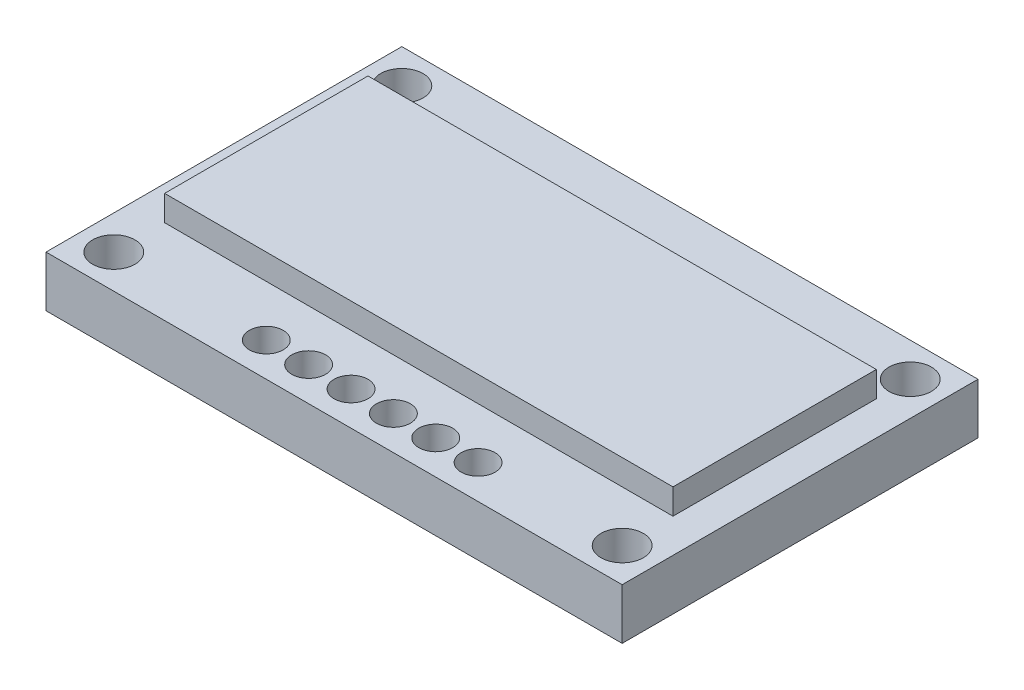
ISO-10303-21;
HEADER;
FILE_DESCRIPTION(('STEP AP214'),'2;1');
FILE_NAME('part.step','',(''),(''),'','','');
FILE_SCHEMA(('AUTOMOTIVE_DESIGN { 1 0 10303 214 1 1 1 1 }'));
ENDSEC;
DATA;
#1=APPLICATION_CONTEXT('core data for automotive mechanical design processes');
#2=APPLICATION_PROTOCOL_DEFINITION('international standard','automotive_design',2000,#1);
#3=PRODUCT_CONTEXT('',#1,'mechanical');
#4=PRODUCT('Part','Part','',(#3));
#5=PRODUCT_RELATED_PRODUCT_CATEGORY('part','',(#4));
#6=PRODUCT_DEFINITION_FORMATION('','',#4);
#7=PRODUCT_DEFINITION_CONTEXT('part definition',#1,'design');
#8=PRODUCT_DEFINITION('design','',#6,#7);
#9=PRODUCT_DEFINITION_SHAPE('','',#8);
#10=(LENGTH_UNIT() NAMED_UNIT(*) SI_UNIT(.MILLI.,.METRE.));
#11=(NAMED_UNIT(*) PLANE_ANGLE_UNIT() SI_UNIT($,.RADIAN.));
#12=(NAMED_UNIT(*) SI_UNIT($,.STERADIAN.) SOLID_ANGLE_UNIT());
#13=UNCERTAINTY_MEASURE_WITH_UNIT(LENGTH_MEASURE(1.E-05),#10,'distance_accuracy_value','');
#14=(GEOMETRIC_REPRESENTATION_CONTEXT(3) GLOBAL_UNCERTAINTY_ASSIGNED_CONTEXT((#13)) GLOBAL_UNIT_ASSIGNED_CONTEXT((#10,
#11,#12)) REPRESENTATION_CONTEXT('',''));
#15=CARTESIAN_POINT('',(0.,0.,0.));
#16=DIRECTION('',(0.,0.,1.));
#17=DIRECTION('',(1.,0.,0.));
#18=AXIS2_PLACEMENT_3D('',#15,#16,#17);
#19=CARTESIAN_POINT('',(0.,3.,0.));
#20=DIRECTION('',(0.,-1.,0.));
#21=DIRECTION('',(0.,0.,-1.));
#22=AXIS2_PLACEMENT_3D('',#19,#20,#21);
#23=PLANE('',#22);
#24=CARTESIAN_POINT('',(32.,3.,-2.));
#25=DIRECTION('',(0.,1.,0.));
#26=DIRECTION('',(0.,0.,1.));
#27=AXIS2_PLACEMENT_3D('',#24,#25,#26);
#28=CIRCLE('',#27,1.25);
#29=CARTESIAN_POINT('',(32.,3.,-0.750000000000002));
#30=VERTEX_POINT('',#29);
#31=EDGE_CURVE('E195',#30,#30,#28,.T.);
#32=ORIENTED_EDGE('',*,*,#31,.F.);
#33=EDGE_LOOP('',(#32));
#34=FACE_BOUND('',#33,.T.);
#35=CARTESIAN_POINT('',(32.,3.,-19.));
#36=DIRECTION('',(0.,1.,0.));
#37=DIRECTION('',(0.,0.,1.));
#38=AXIS2_PLACEMENT_3D('',#35,#36,#37);
#39=CIRCLE('',#38,1.25);
#40=CARTESIAN_POINT('',(32.,3.,-17.75));
#41=VERTEX_POINT('',#40);
#42=EDGE_CURVE('E185',#41,#41,#39,.T.);
#43=ORIENTED_EDGE('',*,*,#42,.F.);
#44=EDGE_LOOP('',(#43));
#45=FACE_BOUND('',#44,.T.);
#46=CARTESIAN_POINT('',(2.,3.,-19.));
#47=DIRECTION('',(0.,1.,0.));
#48=DIRECTION('',(0.,0.,1.));
#49=AXIS2_PLACEMENT_3D('',#46,#47,#48);
#50=CIRCLE('',#49,1.25);
#51=CARTESIAN_POINT('',(2.,3.,-17.75));
#52=VERTEX_POINT('',#51);
#53=EDGE_CURVE('E182',#52,#52,#50,.T.);
#54=ORIENTED_EDGE('',*,*,#53,.F.);
#55=EDGE_LOOP('',(#54));
#56=FACE_BOUND('',#55,.T.);
#57=CARTESIAN_POINT('',(2.,3.,-2.));
#58=DIRECTION('',(0.,1.,0.));
#59=DIRECTION('',(0.,0.,1.));
#60=AXIS2_PLACEMENT_3D('',#57,#58,#59);
#61=CIRCLE('',#60,1.25);
#62=CARTESIAN_POINT('',(2.,3.,-0.75));
#63=VERTEX_POINT('',#62);
#64=EDGE_CURVE('E179',#63,#63,#61,.T.);
#65=ORIENTED_EDGE('',*,*,#64,.F.);
#66=EDGE_LOOP('',(#65));
#67=FACE_BOUND('',#66,.T.);
#68=CARTESIAN_POINT('',(23.5,3.,-2.));
#69=DIRECTION('',(0.,1.,0.));
#70=DIRECTION('',(0.,0.,1.));
#71=AXIS2_PLACEMENT_3D('',#68,#69,#70);
#72=CIRCLE('',#71,1.);
#73=CARTESIAN_POINT('',(23.5,3.,-0.999999999999999));
#74=VERTEX_POINT('',#73);
#75=EDGE_CURVE('E175',#74,#74,#72,.T.);
#76=ORIENTED_EDGE('',*,*,#75,.F.);
#77=EDGE_LOOP('',(#76));
#78=FACE_BOUND('',#77,.T.);
#79=CARTESIAN_POINT('',(21.,3.,-2.));
#80=DIRECTION('',(0.,1.,0.));
#81=DIRECTION('',(0.,0.,1.));
#82=AXIS2_PLACEMENT_3D('',#79,#80,#81);
#83=CIRCLE('',#82,1.);
#84=CARTESIAN_POINT('',(21.,3.,-0.999999999999999));
#85=VERTEX_POINT('',#84);
#86=EDGE_CURVE('E171',#85,#85,#83,.T.);
#87=ORIENTED_EDGE('',*,*,#86,.F.);
#88=EDGE_LOOP('',(#87));
#89=FACE_BOUND('',#88,.T.);
#90=CARTESIAN_POINT('',(18.5,3.,-2.));
#91=DIRECTION('',(0.,1.,0.));
#92=DIRECTION('',(0.,0.,1.));
#93=AXIS2_PLACEMENT_3D('',#90,#91,#92);
#94=CIRCLE('',#93,1.);
#95=CARTESIAN_POINT('',(18.5,3.,-0.999999999999999));
#96=VERTEX_POINT('',#95);
#97=EDGE_CURVE('E167',#96,#96,#94,.T.);
#98=ORIENTED_EDGE('',*,*,#97,.F.);
#99=EDGE_LOOP('',(#98));
#100=FACE_BOUND('',#99,.T.);
#101=CARTESIAN_POINT('',(16.,3.,-2.));
#102=DIRECTION('',(0.,1.,0.));
#103=DIRECTION('',(0.,0.,1.));
#104=AXIS2_PLACEMENT_3D('',#101,#102,#103);
#105=CIRCLE('',#104,1.);
#106=CARTESIAN_POINT('',(16.,3.,-0.999999999999999));
#107=VERTEX_POINT('',#106);
#108=EDGE_CURVE('E163',#107,#107,#105,.T.);
#109=ORIENTED_EDGE('',*,*,#108,.F.);
#110=EDGE_LOOP('',(#109));
#111=FACE_BOUND('',#110,.T.);
#112=CARTESIAN_POINT('',(13.5,3.,-2.));
#113=DIRECTION('',(0.,1.,0.));
#114=DIRECTION('',(0.,0.,1.));
#115=AXIS2_PLACEMENT_3D('',#112,#113,#114);
#116=CIRCLE('',#115,1.);
#117=CARTESIAN_POINT('',(13.5,3.,-0.999999999999999));
#118=VERTEX_POINT('',#117);
#119=EDGE_CURVE('E159',#118,#118,#116,.T.);
#120=ORIENTED_EDGE('',*,*,#119,.F.);
#121=EDGE_LOOP('',(#120));
#122=FACE_BOUND('',#121,.T.);
#123=CARTESIAN_POINT('',(11.,3.,-2.));
#124=DIRECTION('',(0.,1.,0.));
#125=DIRECTION('',(0.,0.,1.));
#126=AXIS2_PLACEMENT_3D('',#123,#124,#125);
#127=CIRCLE('',#126,1.);
#128=CARTESIAN_POINT('',(11.,3.,-0.999999999999999));
#129=VERTEX_POINT('',#128);
#130=EDGE_CURVE('E155',#129,#129,#127,.T.);
#131=ORIENTED_EDGE('',*,*,#130,.F.);
#132=EDGE_LOOP('',(#131));
#133=FACE_BOUND('',#132,.T.);
#134=DIRECTION('',(0.,0.,1.));
#135=VECTOR('',#134,1.);
#136=CARTESIAN_POINT('',(0.,3.,0.));
#137=LINE('',#136,#135);
#138=CARTESIAN_POINT('',(0.,3.,-21.));
#139=VERTEX_POINT('',#138);
#140=CARTESIAN_POINT('',(0.,3.,0.));
#141=VERTEX_POINT('',#140);
#142=EDGE_CURVE('E130',#139,#141,#137,.T.);
#143=ORIENTED_EDGE('',*,*,#142,.T.);
#144=DIRECTION('',(1.,0.,0.));
#145=VECTOR('',#144,1.);
#146=CARTESIAN_POINT('',(0.,3.,0.));
#147=LINE('',#146,#145);
#148=CARTESIAN_POINT('',(34.,3.,0.));
#149=VERTEX_POINT('',#148);
#150=EDGE_CURVE('E133',#141,#149,#147,.T.);
#151=ORIENTED_EDGE('',*,*,#150,.T.);
#152=DIRECTION('',(0.,0.,-1.));
#153=VECTOR('',#152,1.);
#154=CARTESIAN_POINT('',(34.,3.,0.));
#155=LINE('',#154,#153);
#156=CARTESIAN_POINT('',(34.,3.,-21.));
#157=VERTEX_POINT('',#156);
#158=EDGE_CURVE('E136',#149,#157,#155,.T.);
#159=ORIENTED_EDGE('',*,*,#158,.T.);
#160=DIRECTION('',(-1.,0.,0.));
#161=VECTOR('',#160,1.);
#162=CARTESIAN_POINT('',(0.,3.,-21.));
#163=LINE('',#162,#161);
#164=EDGE_CURVE('E138',#157,#139,#163,.T.);
#165=ORIENTED_EDGE('',*,*,#164,.T.);
#166=EDGE_LOOP('',(#143,#151,#159,#165));
#167=FACE_BOUND('',#166,.T.);
#168=DIRECTION('',(0.,0.,1.));
#169=VECTOR('',#168,1.);
#170=CARTESIAN_POINT('',(2.,3.,-17.));
#171=LINE('',#170,#169);
#172=CARTESIAN_POINT('',(2.,3.,-17.));
#173=VERTEX_POINT('',#172);
#174=CARTESIAN_POINT('',(2.,3.,-5.));
#175=VERTEX_POINT('',#174);
#176=EDGE_CURVE('E120',#173,#175,#171,.T.);
#177=ORIENTED_EDGE('',*,*,#176,.F.);
#178=DIRECTION('',(-1.,0.,0.));
#179=VECTOR('',#178,1.);
#180=CARTESIAN_POINT('',(2.,3.,-17.));
#181=LINE('',#180,#179);
#182=CARTESIAN_POINT('',(32.,3.,-17.));
#183=VERTEX_POINT('',#182);
#184=EDGE_CURVE('E117',#183,#173,#181,.T.);
#185=ORIENTED_EDGE('',*,*,#184,.F.);
#186=DIRECTION('',(0.,0.,-1.));
#187=VECTOR('',#186,1.);
#188=CARTESIAN_POINT('',(32.,3.,-17.));
#189=LINE('',#188,#187);
#190=CARTESIAN_POINT('',(32.,3.,-5.));
#191=VERTEX_POINT('',#190);
#192=EDGE_CURVE('E55',#191,#183,#189,.T.);
#193=ORIENTED_EDGE('',*,*,#192,.F.);
#194=DIRECTION('',(1.,0.,0.));
#195=VECTOR('',#194,1.);
#196=CARTESIAN_POINT('',(2.,3.,-5.));
#197=LINE('',#196,#195);
#198=EDGE_CURVE('E50',#175,#191,#197,.T.);
#199=ORIENTED_EDGE('',*,*,#198,.F.);
#200=EDGE_LOOP('',(#177,#185,#193,#199));
#201=FACE_BOUND('',#200,.T.);
#202=ADVANCED_FACE('F33',(#34,#45,#56,#67,#78,#89,#100,#111,#122,#133,#167,#201),#23,.F.);
#203=CARTESIAN_POINT('',(0.,3.,0.));
#204=DIRECTION('',(1.,0.,0.));
#205=DIRECTION('',(0.,0.,-1.));
#206=AXIS2_PLACEMENT_3D('',#203,#204,#205);
#207=PLANE('',#206);
#208=DIRECTION('',(0.,0.,1.));
#209=VECTOR('',#208,1.);
#210=CARTESIAN_POINT('',(0.,0.,0.));
#211=LINE('',#210,#209);
#212=CARTESIAN_POINT('',(0.,0.,-21.));
#213=VERTEX_POINT('',#212);
#214=CARTESIAN_POINT('',(0.,0.,0.));
#215=VERTEX_POINT('',#214);
#216=EDGE_CURVE('E121',#213,#215,#211,.T.);
#217=ORIENTED_EDGE('',*,*,#216,.T.);
#218=DIRECTION('',(0.,-1.,0.));
#219=VECTOR('',#218,1.);
#220=CARTESIAN_POINT('',(0.,3.,0.));
#221=LINE('',#220,#219);
#222=EDGE_CURVE('E11',#141,#215,#221,.T.);
#223=ORIENTED_EDGE('',*,*,#222,.F.);
#224=ORIENTED_EDGE('',*,*,#142,.F.);
#225=DIRECTION('',(0.,-1.,0.));
#226=VECTOR('',#225,1.);
#227=CARTESIAN_POINT('',(0.,3.,-21.));
#228=LINE('',#227,#226);
#229=EDGE_CURVE('E139',#139,#213,#228,.T.);
#230=ORIENTED_EDGE('',*,*,#229,.T.);
#231=EDGE_LOOP('',(#217,#223,#224,#230));
#232=FACE_BOUND('',#231,.T.);
#233=ADVANCED_FACE('F35',(#232),#207,.F.);
#234=CARTESIAN_POINT('',(0.,3.,0.));
#235=DIRECTION('',(0.,0.,-1.));
#236=DIRECTION('',(-1.,0.,0.));
#237=AXIS2_PLACEMENT_3D('',#234,#235,#236);
#238=PLANE('',#237);
#239=DIRECTION('',(1.,0.,0.));
#240=VECTOR('',#239,1.);
#241=CARTESIAN_POINT('',(0.,0.,0.));
#242=LINE('',#241,#240);
#243=CARTESIAN_POINT('',(34.,0.,0.));
#244=VERTEX_POINT('',#243);
#245=EDGE_CURVE('E124',#215,#244,#242,.T.);
#246=ORIENTED_EDGE('',*,*,#245,.T.);
#247=DIRECTION('',(0.,-1.,0.));
#248=VECTOR('',#247,1.);
#249=CARTESIAN_POINT('',(34.,3.,0.));
#250=LINE('',#249,#248);
#251=EDGE_CURVE('E42',#149,#244,#250,.T.);
#252=ORIENTED_EDGE('',*,*,#251,.F.);
#253=ORIENTED_EDGE('',*,*,#150,.F.);
#254=ORIENTED_EDGE('',*,*,#222,.T.);
#255=EDGE_LOOP('',(#246,#252,#253,#254));
#256=FACE_BOUND('',#255,.T.);
#257=ADVANCED_FACE('F240',(#256),#238,.F.);
#258=CARTESIAN_POINT('',(34.,3.,0.));
#259=DIRECTION('',(-1.,0.,0.));
#260=DIRECTION('',(0.,0.,1.));
#261=AXIS2_PLACEMENT_3D('',#258,#259,#260);
#262=PLANE('',#261);
#263=DIRECTION('',(0.,0.,-1.));
#264=VECTOR('',#263,1.);
#265=CARTESIAN_POINT('',(34.,0.,0.));
#266=LINE('',#265,#264);
#267=CARTESIAN_POINT('',(34.,0.,-21.));
#268=VERTEX_POINT('',#267);
#269=EDGE_CURVE('E142',#244,#268,#266,.T.);
#270=ORIENTED_EDGE('',*,*,#269,.T.);
#271=DIRECTION('',(0.,-1.,0.));
#272=VECTOR('',#271,1.);
#273=CARTESIAN_POINT('',(34.,3.,-21.));
#274=LINE('',#273,#272);
#275=EDGE_CURVE('E147',#157,#268,#274,.T.);
#276=ORIENTED_EDGE('',*,*,#275,.F.);
#277=ORIENTED_EDGE('',*,*,#158,.F.);
#278=ORIENTED_EDGE('',*,*,#251,.T.);
#279=EDGE_LOOP('',(#270,#276,#277,#278));
#280=FACE_BOUND('',#279,.T.);
#281=ADVANCED_FACE('F253',(#280),#262,.F.);
#282=CARTESIAN_POINT('',(0.,3.,-21.));
#283=DIRECTION('',(0.,0.,1.));
#284=DIRECTION('',(1.,0.,0.));
#285=AXIS2_PLACEMENT_3D('',#282,#283,#284);
#286=PLANE('',#285);
#287=DIRECTION('',(-1.,0.,0.));
#288=VECTOR('',#287,1.);
#289=CARTESIAN_POINT('',(0.,0.,-21.));
#290=LINE('',#289,#288);
#291=EDGE_CURVE('E134',#268,#213,#290,.T.);
#292=ORIENTED_EDGE('',*,*,#291,.T.);
#293=ORIENTED_EDGE('',*,*,#229,.F.);
#294=ORIENTED_EDGE('',*,*,#164,.F.);
#295=ORIENTED_EDGE('',*,*,#275,.T.);
#296=EDGE_LOOP('',(#292,#293,#294,#295));
#297=FACE_BOUND('',#296,.T.);
#298=ADVANCED_FACE('F249',(#297),#286,.F.);
#299=CARTESIAN_POINT('',(0.,0.,0.));
#300=DIRECTION('',(0.,-1.,0.));
#301=DIRECTION('',(0.,0.,-1.));
#302=AXIS2_PLACEMENT_3D('',#299,#300,#301);
#303=PLANE('',#302);
#304=CARTESIAN_POINT('',(32.,0.,-2.));
#305=DIRECTION('',(0.,-1.,0.));
#306=DIRECTION('',(0.,0.,-1.));
#307=AXIS2_PLACEMENT_3D('',#304,#305,#306);
#308=CIRCLE('',#307,1.25);
#309=CARTESIAN_POINT('',(32.,0.,-3.25));
#310=VERTEX_POINT('',#309);
#311=EDGE_CURVE('E37',#310,#310,#308,.T.);
#312=ORIENTED_EDGE('',*,*,#311,.F.);
#313=EDGE_LOOP('',(#312));
#314=FACE_BOUND('',#313,.T.);
#315=CARTESIAN_POINT('',(32.,0.,-19.));
#316=DIRECTION('',(0.,-1.,0.));
#317=DIRECTION('',(0.,0.,-1.));
#318=AXIS2_PLACEMENT_3D('',#315,#316,#317);
#319=CIRCLE('',#318,1.25);
#320=CARTESIAN_POINT('',(32.,0.,-20.25));
#321=VERTEX_POINT('',#320);
#322=EDGE_CURVE('E183',#321,#321,#319,.T.);
#323=ORIENTED_EDGE('',*,*,#322,.F.);
#324=EDGE_LOOP('',(#323));
#325=FACE_BOUND('',#324,.T.);
#326=CARTESIAN_POINT('',(2.,0.,-19.));
#327=DIRECTION('',(0.,-1.,0.));
#328=DIRECTION('',(0.,0.,-1.));
#329=AXIS2_PLACEMENT_3D('',#326,#327,#328);
#330=CIRCLE('',#329,1.25);
#331=CARTESIAN_POINT('',(2.,0.,-20.25));
#332=VERTEX_POINT('',#331);
#333=EDGE_CURVE('E180',#332,#332,#330,.T.);
#334=ORIENTED_EDGE('',*,*,#333,.F.);
#335=EDGE_LOOP('',(#334));
#336=FACE_BOUND('',#335,.T.);
#337=CARTESIAN_POINT('',(2.,0.,-2.));
#338=DIRECTION('',(0.,-1.,0.));
#339=DIRECTION('',(0.,0.,-1.));
#340=AXIS2_PLACEMENT_3D('',#337,#338,#339);
#341=CIRCLE('',#340,1.25);
#342=CARTESIAN_POINT('',(2.,0.,-3.25));
#343=VERTEX_POINT('',#342);
#344=EDGE_CURVE('E176',#343,#343,#341,.T.);
#345=ORIENTED_EDGE('',*,*,#344,.F.);
#346=EDGE_LOOP('',(#345));
#347=FACE_BOUND('',#346,.T.);
#348=CARTESIAN_POINT('',(23.5,0.,-2.));
#349=DIRECTION('',(0.,-1.,0.));
#350=DIRECTION('',(0.,0.,-1.));
#351=AXIS2_PLACEMENT_3D('',#348,#349,#350);
#352=CIRCLE('',#351,1.);
#353=CARTESIAN_POINT('',(23.5,0.,-3.));
#354=VERTEX_POINT('',#353);
#355=EDGE_CURVE('E172',#354,#354,#352,.T.);
#356=ORIENTED_EDGE('',*,*,#355,.F.);
#357=EDGE_LOOP('',(#356));
#358=FACE_BOUND('',#357,.T.);
#359=CARTESIAN_POINT('',(21.,0.,-2.));
#360=DIRECTION('',(0.,-1.,0.));
#361=DIRECTION('',(0.,0.,-1.));
#362=AXIS2_PLACEMENT_3D('',#359,#360,#361);
#363=CIRCLE('',#362,1.);
#364=CARTESIAN_POINT('',(21.,0.,-3.));
#365=VERTEX_POINT('',#364);
#366=EDGE_CURVE('E168',#365,#365,#363,.T.);
#367=ORIENTED_EDGE('',*,*,#366,.F.);
#368=EDGE_LOOP('',(#367));
#369=FACE_BOUND('',#368,.T.);
#370=CARTESIAN_POINT('',(18.5,0.,-2.));
#371=DIRECTION('',(0.,-1.,0.));
#372=DIRECTION('',(0.,0.,-1.));
#373=AXIS2_PLACEMENT_3D('',#370,#371,#372);
#374=CIRCLE('',#373,1.);
#375=CARTESIAN_POINT('',(18.5,0.,-3.));
#376=VERTEX_POINT('',#375);
#377=EDGE_CURVE('E164',#376,#376,#374,.T.);
#378=ORIENTED_EDGE('',*,*,#377,.F.);
#379=EDGE_LOOP('',(#378));
#380=FACE_BOUND('',#379,.T.);
#381=CARTESIAN_POINT('',(16.,0.,-2.));
#382=DIRECTION('',(0.,-1.,0.));
#383=DIRECTION('',(0.,0.,-1.));
#384=AXIS2_PLACEMENT_3D('',#381,#382,#383);
#385=CIRCLE('',#384,1.);
#386=CARTESIAN_POINT('',(16.,0.,-3.));
#387=VERTEX_POINT('',#386);
#388=EDGE_CURVE('E160',#387,#387,#385,.T.);
#389=ORIENTED_EDGE('',*,*,#388,.F.);
#390=EDGE_LOOP('',(#389));
#391=FACE_BOUND('',#390,.T.);
#392=CARTESIAN_POINT('',(13.5,0.,-2.));
#393=DIRECTION('',(0.,-1.,0.));
#394=DIRECTION('',(0.,0.,-1.));
#395=AXIS2_PLACEMENT_3D('',#392,#393,#394);
#396=CIRCLE('',#395,1.);
#397=CARTESIAN_POINT('',(13.5,0.,-3.));
#398=VERTEX_POINT('',#397);
#399=EDGE_CURVE('E156',#398,#398,#396,.T.);
#400=ORIENTED_EDGE('',*,*,#399,.F.);
#401=EDGE_LOOP('',(#400));
#402=FACE_BOUND('',#401,.T.);
#403=CARTESIAN_POINT('',(11.,0.,-2.));
#404=DIRECTION('',(0.,-1.,0.));
#405=DIRECTION('',(0.,0.,-1.));
#406=AXIS2_PLACEMENT_3D('',#403,#404,#405);
#407=CIRCLE('',#406,1.);
#408=CARTESIAN_POINT('',(11.,0.,-3.));
#409=VERTEX_POINT('',#408);
#410=EDGE_CURVE('E152',#409,#409,#407,.T.);
#411=ORIENTED_EDGE('',*,*,#410,.F.);
#412=EDGE_LOOP('',(#411));
#413=FACE_BOUND('',#412,.T.);
#414=ORIENTED_EDGE('',*,*,#216,.F.);
#415=ORIENTED_EDGE('',*,*,#291,.F.);
#416=ORIENTED_EDGE('',*,*,#269,.F.);
#417=ORIENTED_EDGE('',*,*,#245,.F.);
#418=EDGE_LOOP('',(#414,#415,#416,#417));
#419=FACE_BOUND('',#418,.T.);
#420=ADVANCED_FACE('F246',(#314,#325,#336,#347,#358,#369,#380,#391,#402,#413,#419),#303,.T.);
#421=CARTESIAN_POINT('',(2.,4.5,-17.));
#422=DIRECTION('',(1.,0.,0.));
#423=DIRECTION('',(0.,0.,-1.));
#424=AXIS2_PLACEMENT_3D('',#421,#422,#423);
#425=PLANE('',#424);
#426=ORIENTED_EDGE('',*,*,#176,.T.);
#427=DIRECTION('',(0.,-1.,0.));
#428=VECTOR('',#427,1.);
#429=CARTESIAN_POINT('',(2.,4.5,-5.));
#430=LINE('',#429,#428);
#431=CARTESIAN_POINT('',(2.,4.5,-5.));
#432=VERTEX_POINT('',#431);
#433=EDGE_CURVE('E101',#432,#175,#430,.T.);
#434=ORIENTED_EDGE('',*,*,#433,.F.);
#435=DIRECTION('',(0.,0.,1.));
#436=VECTOR('',#435,1.);
#437=CARTESIAN_POINT('',(2.,4.5,-17.));
#438=LINE('',#437,#436);
#439=CARTESIAN_POINT('',(2.,4.5,-17.));
#440=VERTEX_POINT('',#439);
#441=EDGE_CURVE('E108',#440,#432,#438,.T.);
#442=ORIENTED_EDGE('',*,*,#441,.F.);
#443=DIRECTION('',(0.,-1.,0.));
#444=VECTOR('',#443,1.);
#445=CARTESIAN_POINT('',(2.,4.5,-17.));
#446=LINE('',#445,#444);
#447=EDGE_CURVE('E214',#440,#173,#446,.T.);
#448=ORIENTED_EDGE('',*,*,#447,.T.);
#449=EDGE_LOOP('',(#426,#434,#442,#448));
#450=FACE_BOUND('',#449,.T.);
#451=ADVANCED_FACE('F119',(#450),#425,.F.);
#452=CARTESIAN_POINT('',(2.,4.5,-5.));
#453=DIRECTION('',(0.,0.,-1.));
#454=DIRECTION('',(-1.,0.,0.));
#455=AXIS2_PLACEMENT_3D('',#452,#453,#454);
#456=PLANE('',#455);
#457=ORIENTED_EDGE('',*,*,#198,.T.);
#458=DIRECTION('',(0.,-1.,0.));
#459=VECTOR('',#458,1.);
#460=CARTESIAN_POINT('',(32.,4.5,-5.));
#461=LINE('',#460,#459);
#462=CARTESIAN_POINT('',(32.,4.5,-5.));
#463=VERTEX_POINT('',#462);
#464=EDGE_CURVE('E104',#463,#191,#461,.T.);
#465=ORIENTED_EDGE('',*,*,#464,.F.);
#466=DIRECTION('',(1.,0.,0.));
#467=VECTOR('',#466,1.);
#468=CARTESIAN_POINT('',(2.,4.5,-5.));
#469=LINE('',#468,#467);
#470=EDGE_CURVE('E97',#432,#463,#469,.T.);
#471=ORIENTED_EDGE('',*,*,#470,.F.);
#472=ORIENTED_EDGE('',*,*,#433,.T.);
#473=EDGE_LOOP('',(#457,#465,#471,#472));
#474=FACE_BOUND('',#473,.T.);
#475=ADVANCED_FACE('F99',(#474),#456,.F.);
#476=CARTESIAN_POINT('',(32.,4.5,-17.));
#477=DIRECTION('',(-1.,0.,0.));
#478=DIRECTION('',(0.,0.,1.));
#479=AXIS2_PLACEMENT_3D('',#476,#477,#478);
#480=PLANE('',#479);
#481=ORIENTED_EDGE('',*,*,#192,.T.);
#482=DIRECTION('',(0.,-1.,0.));
#483=VECTOR('',#482,1.);
#484=CARTESIAN_POINT('',(32.,4.5,-17.));
#485=LINE('',#484,#483);
#486=CARTESIAN_POINT('',(32.,4.5,-17.));
#487=VERTEX_POINT('',#486);
#488=EDGE_CURVE('E126',#487,#183,#485,.T.);
#489=ORIENTED_EDGE('',*,*,#488,.F.);
#490=DIRECTION('',(0.,0.,-1.));
#491=VECTOR('',#490,1.);
#492=CARTESIAN_POINT('',(32.,4.5,-17.));
#493=LINE('',#492,#491);
#494=EDGE_CURVE('E107',#463,#487,#493,.T.);
#495=ORIENTED_EDGE('',*,*,#494,.F.);
#496=ORIENTED_EDGE('',*,*,#464,.T.);
#497=EDGE_LOOP('',(#481,#489,#495,#496));
#498=FACE_BOUND('',#497,.T.);
#499=ADVANCED_FACE('F225',(#498),#480,.F.);
#500=CARTESIAN_POINT('',(2.,4.5,-17.));
#501=DIRECTION('',(0.,0.,1.));
#502=DIRECTION('',(1.,0.,0.));
#503=AXIS2_PLACEMENT_3D('',#500,#501,#502);
#504=PLANE('',#503);
#505=ORIENTED_EDGE('',*,*,#184,.T.);
#506=ORIENTED_EDGE('',*,*,#447,.F.);
#507=DIRECTION('',(-1.,0.,0.));
#508=VECTOR('',#507,1.);
#509=CARTESIAN_POINT('',(2.,4.5,-17.));
#510=LINE('',#509,#508);
#511=EDGE_CURVE('E113',#487,#440,#510,.T.);
#512=ORIENTED_EDGE('',*,*,#511,.F.);
#513=ORIENTED_EDGE('',*,*,#488,.T.);
#514=EDGE_LOOP('',(#505,#506,#512,#513));
#515=FACE_BOUND('',#514,.T.);
#516=ADVANCED_FACE('F223',(#515),#504,.F.);
#517=CARTESIAN_POINT('',(0.,4.5,0.));
#518=DIRECTION('',(0.,1.,0.));
#519=DIRECTION('',(0.,0.,1.));
#520=AXIS2_PLACEMENT_3D('',#517,#518,#519);
#521=PLANE('',#520);
#522=ORIENTED_EDGE('',*,*,#441,.T.);
#523=ORIENTED_EDGE('',*,*,#470,.T.);
#524=ORIENTED_EDGE('',*,*,#494,.T.);
#525=ORIENTED_EDGE('',*,*,#511,.T.);
#526=EDGE_LOOP('',(#522,#523,#524,#525));
#527=FACE_BOUND('',#526,.T.);
#528=ADVANCED_FACE('F111',(#527),#521,.T.);
#529=CARTESIAN_POINT('',(11.,-2.,-2.));
#530=DIRECTION('',(0.,1.,0.));
#531=DIRECTION('',(0.,0.,1.));
#532=AXIS2_PLACEMENT_3D('',#529,#530,#531);
#533=CYLINDRICAL_SURFACE('',#532,1.);
#534=ORIENTED_EDGE('',*,*,#410,.T.);
#535=EDGE_LOOP('',(#534));
#536=FACE_BOUND('',#535,.T.);
#537=ORIENTED_EDGE('',*,*,#130,.T.);
#538=EDGE_LOOP('',(#537));
#539=FACE_BOUND('',#538,.T.);
#540=ADVANCED_FACE('F315',(#536,#539),#533,.F.);
#541=CARTESIAN_POINT('',(13.5,-2.,-2.));
#542=DIRECTION('',(0.,1.,0.));
#543=DIRECTION('',(0.,0.,1.));
#544=AXIS2_PLACEMENT_3D('',#541,#542,#543);
#545=CYLINDRICAL_SURFACE('',#544,1.);
#546=ORIENTED_EDGE('',*,*,#399,.T.);
#547=EDGE_LOOP('',(#546));
#548=FACE_BOUND('',#547,.T.);
#549=ORIENTED_EDGE('',*,*,#119,.T.);
#550=EDGE_LOOP('',(#549));
#551=FACE_BOUND('',#550,.T.);
#552=ADVANCED_FACE('F342',(#548,#551),#545,.F.);
#553=CARTESIAN_POINT('',(16.,-2.,-2.));
#554=DIRECTION('',(0.,1.,0.));
#555=DIRECTION('',(0.,0.,1.));
#556=AXIS2_PLACEMENT_3D('',#553,#554,#555);
#557=CYLINDRICAL_SURFACE('',#556,1.);
#558=ORIENTED_EDGE('',*,*,#388,.T.);
#559=EDGE_LOOP('',(#558));
#560=FACE_BOUND('',#559,.T.);
#561=ORIENTED_EDGE('',*,*,#108,.T.);
#562=EDGE_LOOP('',(#561));
#563=FACE_BOUND('',#562,.T.);
#564=ADVANCED_FACE('F349',(#560,#563),#557,.F.);
#565=CARTESIAN_POINT('',(18.5,-2.,-2.));
#566=DIRECTION('',(0.,1.,0.));
#567=DIRECTION('',(0.,0.,1.));
#568=AXIS2_PLACEMENT_3D('',#565,#566,#567);
#569=CYLINDRICAL_SURFACE('',#568,1.);
#570=ORIENTED_EDGE('',*,*,#377,.T.);
#571=EDGE_LOOP('',(#570));
#572=FACE_BOUND('',#571,.T.);
#573=ORIENTED_EDGE('',*,*,#97,.T.);
#574=EDGE_LOOP('',(#573));
#575=FACE_BOUND('',#574,.T.);
#576=ADVANCED_FACE('F357',(#572,#575),#569,.F.);
#577=CARTESIAN_POINT('',(21.,-2.,-2.));
#578=DIRECTION('',(0.,1.,0.));
#579=DIRECTION('',(0.,0.,1.));
#580=AXIS2_PLACEMENT_3D('',#577,#578,#579);
#581=CYLINDRICAL_SURFACE('',#580,1.);
#582=ORIENTED_EDGE('',*,*,#366,.T.);
#583=EDGE_LOOP('',(#582));
#584=FACE_BOUND('',#583,.T.);
#585=ORIENTED_EDGE('',*,*,#86,.T.);
#586=EDGE_LOOP('',(#585));
#587=FACE_BOUND('',#586,.T.);
#588=ADVANCED_FACE('F365',(#584,#587),#581,.F.);
#589=CARTESIAN_POINT('',(23.5,-2.,-2.));
#590=DIRECTION('',(0.,1.,0.));
#591=DIRECTION('',(0.,0.,1.));
#592=AXIS2_PLACEMENT_3D('',#589,#590,#591);
#593=CYLINDRICAL_SURFACE('',#592,1.);
#594=ORIENTED_EDGE('',*,*,#355,.T.);
#595=EDGE_LOOP('',(#594));
#596=FACE_BOUND('',#595,.T.);
#597=ORIENTED_EDGE('',*,*,#75,.T.);
#598=EDGE_LOOP('',(#597));
#599=FACE_BOUND('',#598,.T.);
#600=ADVANCED_FACE('F373',(#596,#599),#593,.F.);
#601=CARTESIAN_POINT('',(2.,-2.,-2.));
#602=DIRECTION('',(0.,1.,0.));
#603=DIRECTION('',(0.,0.,1.));
#604=AXIS2_PLACEMENT_3D('',#601,#602,#603);
#605=CYLINDRICAL_SURFACE('',#604,1.25);
#606=ORIENTED_EDGE('',*,*,#344,.T.);
#607=EDGE_LOOP('',(#606));
#608=FACE_BOUND('',#607,.T.);
#609=ORIENTED_EDGE('',*,*,#64,.T.);
#610=EDGE_LOOP('',(#609));
#611=FACE_BOUND('',#610,.T.);
#612=ADVANCED_FACE('F381',(#608,#611),#605,.F.);
#613=CARTESIAN_POINT('',(2.,-2.,-19.));
#614=DIRECTION('',(0.,1.,0.));
#615=DIRECTION('',(0.,0.,1.));
#616=AXIS2_PLACEMENT_3D('',#613,#614,#615);
#617=CYLINDRICAL_SURFACE('',#616,1.25);
#618=ORIENTED_EDGE('',*,*,#333,.T.);
#619=EDGE_LOOP('',(#618));
#620=FACE_BOUND('',#619,.T.);
#621=ORIENTED_EDGE('',*,*,#53,.T.);
#622=EDGE_LOOP('',(#621));
#623=FACE_BOUND('',#622,.T.);
#624=ADVANCED_FACE('F389',(#620,#623),#617,.F.);
#625=CARTESIAN_POINT('',(32.,-2.,-19.));
#626=DIRECTION('',(0.,1.,0.));
#627=DIRECTION('',(0.,0.,1.));
#628=AXIS2_PLACEMENT_3D('',#625,#626,#627);
#629=CYLINDRICAL_SURFACE('',#628,1.25);
#630=ORIENTED_EDGE('',*,*,#322,.T.);
#631=EDGE_LOOP('',(#630));
#632=FACE_BOUND('',#631,.T.);
#633=ORIENTED_EDGE('',*,*,#42,.T.);
#634=EDGE_LOOP('',(#633));
#635=FACE_BOUND('',#634,.T.);
#636=ADVANCED_FACE('F397',(#632,#635),#629,.F.);
#637=CARTESIAN_POINT('',(32.,-2.,-2.));
#638=DIRECTION('',(0.,1.,0.));
#639=DIRECTION('',(0.,0.,1.));
#640=AXIS2_PLACEMENT_3D('',#637,#638,#639);
#641=CYLINDRICAL_SURFACE('',#640,1.25);
#642=ORIENTED_EDGE('',*,*,#311,.T.);
#643=EDGE_LOOP('',(#642));
#644=FACE_BOUND('',#643,.T.);
#645=ORIENTED_EDGE('',*,*,#31,.T.);
#646=EDGE_LOOP('',(#645));
#647=FACE_BOUND('',#646,.T.);
#648=ADVANCED_FACE('F405',(#644,#647),#641,.F.);
#649=CLOSED_SHELL('',(#202,#233,#257,#281,#298,#420,#451,#475,#499,#516,#528,#540,#552,#564,
#576,#588,#600,#612,#624,#636,#648));
#650=MANIFOLD_SOLID_BREP('B2',#649);
#651=ADVANCED_BREP_SHAPE_REPRESENTATION('',(#18,#650),#14);
#652=SHAPE_DEFINITION_REPRESENTATION(#9,#651);
ENDSEC;
END-ISO-10303-21;
